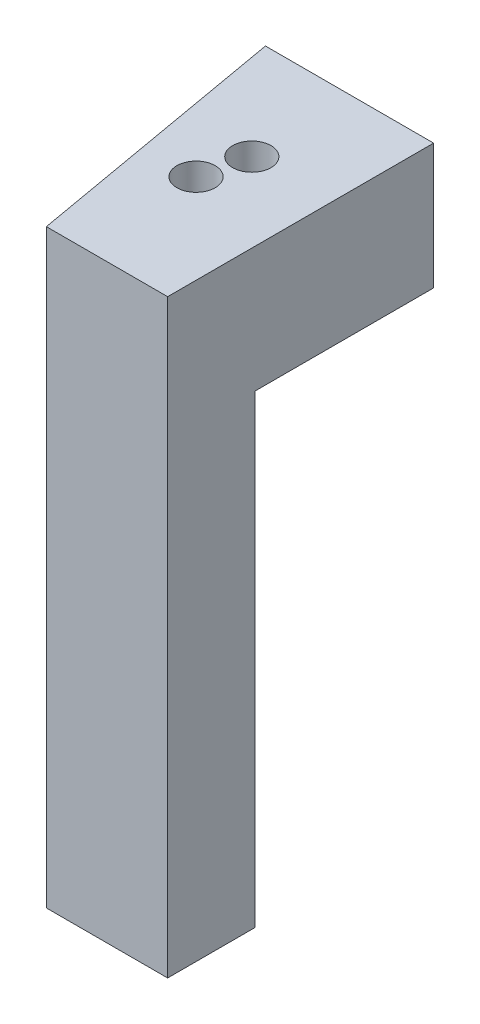
ISO-10303-21;
HEADER;
FILE_DESCRIPTION(('STEP AP214'),'2;1');
FILE_NAME('part.step','',(''),(''),'','','');
FILE_SCHEMA(('AUTOMOTIVE_DESIGN { 1 0 10303 214 1 1 1 1 }'));
ENDSEC;
DATA;
#1=APPLICATION_CONTEXT('core data for automotive mechanical design processes');
#2=APPLICATION_PROTOCOL_DEFINITION('international standard','automotive_design',2000,#1);
#3=PRODUCT_CONTEXT('',#1,'mechanical');
#4=PRODUCT('Part','Part','',(#3));
#5=PRODUCT_RELATED_PRODUCT_CATEGORY('part','',(#4));
#6=PRODUCT_DEFINITION_FORMATION('','',#4);
#7=PRODUCT_DEFINITION_CONTEXT('part definition',#1,'design');
#8=PRODUCT_DEFINITION('design','',#6,#7);
#9=PRODUCT_DEFINITION_SHAPE('','',#8);
#10=(LENGTH_UNIT() NAMED_UNIT(*) SI_UNIT(.MILLI.,.METRE.));
#11=(NAMED_UNIT(*) PLANE_ANGLE_UNIT() SI_UNIT($,.RADIAN.));
#12=(NAMED_UNIT(*) SI_UNIT($,.STERADIAN.) SOLID_ANGLE_UNIT());
#13=UNCERTAINTY_MEASURE_WITH_UNIT(LENGTH_MEASURE(1.E-05),#10,'distance_accuracy_value','');
#14=(GEOMETRIC_REPRESENTATION_CONTEXT(3) GLOBAL_UNCERTAINTY_ASSIGNED_CONTEXT((#13)) GLOBAL_UNIT_ASSIGNED_CONTEXT((#10,
#11,#12)) REPRESENTATION_CONTEXT('',''));
#15=CARTESIAN_POINT('',(0.,0.,0.));
#16=DIRECTION('',(0.,0.,1.));
#17=DIRECTION('',(1.,0.,0.));
#18=AXIS2_PLACEMENT_3D('',#15,#16,#17);
#19=CARTESIAN_POINT('',(10.,50.8,-25.4));
#20=DIRECTION('',(-1.,0.,0.));
#21=DIRECTION('',(0.,0.,1.));
#22=AXIS2_PLACEMENT_3D('',#19,#20,#21);
#23=PLANE('',#22);
#24=DIRECTION('',(0.,0.,-1.));
#25=VECTOR('',#24,1.);
#26=CARTESIAN_POINT('',(10.,50.8,-25.4));
#27=LINE('',#26,#25);
#28=CARTESIAN_POINT('',(10.,50.8,-2.5));
#29=VERTEX_POINT('',#28);
#30=CARTESIAN_POINT('',(10.,50.8,-25.4));
#31=VERTEX_POINT('',#30);
#32=EDGE_CURVE('E108',#29,#31,#27,.T.);
#33=ORIENTED_EDGE('',*,*,#32,.F.);
#34=DIRECTION('',(0.,-1.,0.));
#35=VECTOR('',#34,1.);
#36=CARTESIAN_POINT('',(10.,50.8,-2.5));
#37=LINE('',#36,#35);
#38=CARTESIAN_POINT('',(10.,0.,-2.5));
#39=VERTEX_POINT('',#38);
#40=EDGE_CURVE('E87',#29,#39,#37,.T.);
#41=ORIENTED_EDGE('',*,*,#40,.T.);
#42=DIRECTION('',(0.,0.,-1.));
#43=VECTOR('',#42,1.);
#44=CARTESIAN_POINT('',(10.,0.,-25.4));
#45=LINE('',#44,#43);
#46=CARTESIAN_POINT('',(10.,0.,-10.));
#47=VERTEX_POINT('',#46);
#48=EDGE_CURVE('E55',#39,#47,#45,.T.);
#49=ORIENTED_EDGE('',*,*,#48,.T.);
#50=DIRECTION('',(0.,-1.,0.));
#51=VECTOR('',#50,1.);
#52=CARTESIAN_POINT('',(10.,40.,-10.));
#53=LINE('',#52,#51);
#54=CARTESIAN_POINT('',(10.,40.,-10.));
#55=VERTEX_POINT('',#54);
#56=EDGE_CURVE('E116',#55,#47,#53,.T.);
#57=ORIENTED_EDGE('',*,*,#56,.F.);
#58=DIRECTION('',(0.,0.,1.));
#59=VECTOR('',#58,1.);
#60=CARTESIAN_POINT('',(10.,40.,-10.));
#61=LINE('',#60,#59);
#62=CARTESIAN_POINT('',(10.,40.,-25.4));
#63=VERTEX_POINT('',#62);
#64=EDGE_CURVE('E122',#63,#55,#61,.T.);
#65=ORIENTED_EDGE('',*,*,#64,.F.);
#66=DIRECTION('',(0.,-1.,0.));
#67=VECTOR('',#66,1.);
#68=CARTESIAN_POINT('',(10.,50.8,-25.4));
#69=LINE('',#68,#67);
#70=EDGE_CURVE('E11',#31,#63,#69,.T.);
#71=ORIENTED_EDGE('',*,*,#70,.F.);
#72=EDGE_LOOP('',(#33,#41,#49,#57,#65,#71));
#73=FACE_BOUND('',#72,.T.);
#74=ADVANCED_FACE('F33',(#73),#23,.F.);
#75=CARTESIAN_POINT('',(-4.4787053099951,50.8,-25.4));
#76=DIRECTION('',(0.,0.,1.));
#77=DIRECTION('',(1.,0.,0.));
#78=AXIS2_PLACEMENT_3D('',#75,#76,#77);
#79=PLANE('',#78);
#80=ORIENTED_EDGE('',*,*,#70,.T.);
#81=DIRECTION('',(1.,0.,0.));
#82=VECTOR('',#81,1.);
#83=CARTESIAN_POINT('',(10.,40.,-25.4));
#84=LINE('',#83,#82);
#85=CARTESIAN_POINT('',(-4.4787053099951,40.,-25.4));
#86=VERTEX_POINT('',#85);
#87=EDGE_CURVE('E118',#86,#63,#84,.T.);
#88=ORIENTED_EDGE('',*,*,#87,.F.);
#89=DIRECTION('',(0.,-1.,0.));
#90=VECTOR('',#89,1.);
#91=CARTESIAN_POINT('',(-4.4787053099951,50.8,-25.4));
#92=LINE('',#91,#90);
#93=CARTESIAN_POINT('',(-4.4787053099951,50.8,-25.4));
#94=VERTEX_POINT('',#93);
#95=EDGE_CURVE('E40',#94,#86,#92,.T.);
#96=ORIENTED_EDGE('',*,*,#95,.F.);
#97=DIRECTION('',(-1.,0.,0.));
#98=VECTOR('',#97,1.);
#99=CARTESIAN_POINT('',(-4.4787053099951,50.8,-25.4));
#100=LINE('',#99,#98);
#101=EDGE_CURVE('E105',#31,#94,#100,.T.);
#102=ORIENTED_EDGE('',*,*,#101,.F.);
#103=EDGE_LOOP('',(#80,#88,#96,#102));
#104=FACE_BOUND('',#103,.T.);
#105=ADVANCED_FACE('F164',(#104),#79,.F.);
#106=CARTESIAN_POINT('',(0.,50.8,0.));
#107=DIRECTION('',(0.984807753012208,0.,-0.173648177666934));
#108=DIRECTION('',(-0.173648177666934,0.,-0.984807753012208));
#109=AXIS2_PLACEMENT_3D('',#106,#107,#108);
#110=PLANE('',#109);
#111=DIRECTION('',(0.173648177666934,0.,0.984807753012207));
#112=VECTOR('',#111,1.);
#113=CARTESIAN_POINT('',(0.,0.,0.));
#114=LINE('',#113,#112);
#115=CARTESIAN_POINT('',(-1.76326980708469,0.,-10.));
#116=VERTEX_POINT('',#115);
#117=CARTESIAN_POINT('',(-0.440817451771171,0.,-2.5));
#118=VERTEX_POINT('',#117);
#119=EDGE_CURVE('E101',#116,#118,#114,.T.);
#120=ORIENTED_EDGE('',*,*,#119,.T.);
#121=DIRECTION('',(0.,-1.,0.));
#122=VECTOR('',#121,1.);
#123=CARTESIAN_POINT('',(-0.440817451771171,50.8,-2.5));
#124=LINE('',#123,#122);
#125=CARTESIAN_POINT('',(-0.440817451771171,50.8,-2.5));
#126=VERTEX_POINT('',#125);
#127=EDGE_CURVE('E47',#126,#118,#124,.T.);
#128=ORIENTED_EDGE('',*,*,#127,.F.);
#129=DIRECTION('',(0.173648177666934,0.,0.984807753012207));
#130=VECTOR('',#129,1.);
#131=CARTESIAN_POINT('',(0.,50.8,0.));
#132=LINE('',#131,#130);
#133=EDGE_CURVE('E98',#94,#126,#132,.T.);
#134=ORIENTED_EDGE('',*,*,#133,.F.);
#135=ORIENTED_EDGE('',*,*,#95,.T.);
#136=DIRECTION('',(-0.173648177666934,0.,-0.984807753012207));
#137=VECTOR('',#136,1.);
#138=CARTESIAN_POINT('',(-4.4787053099951,40.,-25.4));
#139=LINE('',#138,#137);
#140=CARTESIAN_POINT('',(-1.76326980708469,40.,-10.));
#141=VERTEX_POINT('',#140);
#142=EDGE_CURVE('E124',#141,#86,#139,.T.);
#143=ORIENTED_EDGE('',*,*,#142,.F.);
#144=DIRECTION('',(0.,-1.,0.));
#145=VECTOR('',#144,1.);
#146=CARTESIAN_POINT('',(-1.76326980708469,40.,-10.));
#147=LINE('',#146,#145);
#148=EDGE_CURVE('E113',#141,#116,#147,.T.);
#149=ORIENTED_EDGE('',*,*,#148,.T.);
#150=EDGE_LOOP('',(#120,#128,#134,#135,#143,#149));
#151=FACE_BOUND('',#150,.T.);
#152=ADVANCED_FACE('F96',(#151),#110,.F.);
#153=CARTESIAN_POINT('',(0.,50.8,0.));
#154=DIRECTION('',(0.,-1.,0.));
#155=DIRECTION('',(0.,0.,-1.));
#156=AXIS2_PLACEMENT_3D('',#153,#154,#155);
#157=PLANE('',#156);
#158=CARTESIAN_POINT('',(3.18210765,50.8,-16.56485457));
#159=DIRECTION('',(0.,-1.,0.));
#160=DIRECTION('',(0.,0.,-1.));
#161=AXIS2_PLACEMENT_3D('',#158,#159,#160);
#162=CIRCLE('',#161,1.65);
#163=CARTESIAN_POINT('',(3.18210765,50.8,-18.21485457));
#164=VERTEX_POINT('',#163);
#165=EDGE_CURVE('E132',#164,#164,#162,.T.);
#166=ORIENTED_EDGE('',*,*,#165,.T.);
#167=EDGE_LOOP('',(#166));
#168=FACE_BOUND('',#167,.T.);
#169=CARTESIAN_POINT('',(2.27814279270817,50.8,-12.66833721));
#170=DIRECTION('',(0.,-1.,0.));
#171=DIRECTION('',(0.,0.,-1.));
#172=AXIS2_PLACEMENT_3D('',#169,#170,#171);
#173=CIRCLE('',#172,1.65);
#174=CARTESIAN_POINT('',(2.27814279270817,50.8,-14.31833721));
#175=VERTEX_POINT('',#174);
#176=EDGE_CURVE('E136',#175,#175,#173,.T.);
#177=ORIENTED_EDGE('',*,*,#176,.T.);
#178=EDGE_LOOP('',(#177));
#179=FACE_BOUND('',#178,.T.);
#180=ORIENTED_EDGE('',*,*,#133,.T.);
#181=DIRECTION('',(1.,0.,0.));
#182=VECTOR('',#181,1.);
#183=CARTESIAN_POINT('',(10.,50.8,-2.5));
#184=LINE('',#183,#182);
#185=EDGE_CURVE('E85',#126,#29,#184,.T.);
#186=ORIENTED_EDGE('',*,*,#185,.T.);
#187=ORIENTED_EDGE('',*,*,#32,.T.);
#188=ORIENTED_EDGE('',*,*,#101,.T.);
#189=EDGE_LOOP('',(#180,#186,#187,#188));
#190=FACE_BOUND('',#189,.T.);
#191=ADVANCED_FACE('F103',(#168,#179,#190),#157,.F.);
#192=CARTESIAN_POINT('',(0.,0.,0.));
#193=DIRECTION('',(0.,-1.,0.));
#194=DIRECTION('',(0.,0.,-1.));
#195=AXIS2_PLACEMENT_3D('',#192,#193,#194);
#196=PLANE('',#195);
#197=DIRECTION('',(1.,0.,0.));
#198=VECTOR('',#197,1.);
#199=CARTESIAN_POINT('',(10.,0.,-2.5));
#200=LINE('',#199,#198);
#201=EDGE_CURVE('E91',#118,#39,#200,.T.);
#202=ORIENTED_EDGE('',*,*,#201,.F.);
#203=ORIENTED_EDGE('',*,*,#119,.F.);
#204=DIRECTION('',(-1.,0.,0.));
#205=VECTOR('',#204,1.);
#206=CARTESIAN_POINT('',(-1.76326980708469,0.,-10.));
#207=LINE('',#206,#205);
#208=EDGE_CURVE('E120',#47,#116,#207,.T.);
#209=ORIENTED_EDGE('',*,*,#208,.F.);
#210=ORIENTED_EDGE('',*,*,#48,.F.);
#211=EDGE_LOOP('',(#202,#203,#209,#210));
#212=FACE_BOUND('',#211,.T.);
#213=ADVANCED_FACE('F162',(#212),#196,.T.);
#214=CARTESIAN_POINT('',(-1.76326980708469,40.,-10.));
#215=DIRECTION('',(0.,0.,1.));
#216=DIRECTION('',(1.,0.,0.));
#217=AXIS2_PLACEMENT_3D('',#214,#215,#216);
#218=PLANE('',#217);
#219=ORIENTED_EDGE('',*,*,#208,.T.);
#220=ORIENTED_EDGE('',*,*,#148,.F.);
#221=DIRECTION('',(-1.,0.,0.));
#222=VECTOR('',#221,1.);
#223=CARTESIAN_POINT('',(-1.76326980708469,40.,-10.));
#224=LINE('',#223,#222);
#225=EDGE_CURVE('E126',#55,#141,#224,.T.);
#226=ORIENTED_EDGE('',*,*,#225,.F.);
#227=ORIENTED_EDGE('',*,*,#56,.T.);
#228=EDGE_LOOP('',(#219,#220,#226,#227));
#229=FACE_BOUND('',#228,.T.);
#230=ADVANCED_FACE('F152',(#229),#218,.F.);
#231=CARTESIAN_POINT('',(0.,40.,0.));
#232=DIRECTION('',(0.,1.,0.));
#233=DIRECTION('',(0.,0.,1.));
#234=AXIS2_PLACEMENT_3D('',#231,#232,#233);
#235=PLANE('',#234);
#236=CARTESIAN_POINT('',(3.18210765,40.,-16.56485457));
#237=DIRECTION('',(0.,-1.,0.));
#238=DIRECTION('',(0.,0.,-1.));
#239=AXIS2_PLACEMENT_3D('',#236,#237,#238);
#240=CIRCLE('',#239,1.65);
#241=CARTESIAN_POINT('',(3.18210765,40.,-18.21485457));
#242=VERTEX_POINT('',#241);
#243=EDGE_CURVE('E139',#242,#242,#240,.T.);
#244=ORIENTED_EDGE('',*,*,#243,.F.);
#245=EDGE_LOOP('',(#244));
#246=FACE_BOUND('',#245,.T.);
#247=CARTESIAN_POINT('',(2.27814279270817,40.,-12.66833721));
#248=DIRECTION('',(0.,-1.,0.));
#249=DIRECTION('',(0.,0.,-1.));
#250=AXIS2_PLACEMENT_3D('',#247,#248,#249);
#251=CIRCLE('',#250,1.65);
#252=CARTESIAN_POINT('',(2.27814279270817,40.,-14.31833721));
#253=VERTEX_POINT('',#252);
#254=EDGE_CURVE('E140',#253,#253,#251,.T.);
#255=ORIENTED_EDGE('',*,*,#254,.F.);
#256=EDGE_LOOP('',(#255));
#257=FACE_BOUND('',#256,.T.);
#258=ORIENTED_EDGE('',*,*,#64,.T.);
#259=ORIENTED_EDGE('',*,*,#225,.T.);
#260=ORIENTED_EDGE('',*,*,#142,.T.);
#261=ORIENTED_EDGE('',*,*,#87,.T.);
#262=EDGE_LOOP('',(#258,#259,#260,#261));
#263=FACE_BOUND('',#262,.T.);
#264=ADVANCED_FACE('F149',(#246,#257,#263),#235,.F.);
#265=CARTESIAN_POINT('',(10.,50.8,-2.5));
#266=DIRECTION('',(0.,0.,-1.));
#267=DIRECTION('',(-1.,0.,0.));
#268=AXIS2_PLACEMENT_3D('',#265,#266,#267);
#269=PLANE('',#268);
#270=ORIENTED_EDGE('',*,*,#201,.T.);
#271=ORIENTED_EDGE('',*,*,#40,.F.);
#272=ORIENTED_EDGE('',*,*,#185,.F.);
#273=ORIENTED_EDGE('',*,*,#127,.T.);
#274=EDGE_LOOP('',(#270,#271,#272,#273));
#275=FACE_BOUND('',#274,.T.);
#276=ADVANCED_FACE('F86',(#275),#269,.F.);
#277=CARTESIAN_POINT('',(2.27814279270817,65.4,-12.66833721));
#278=DIRECTION('',(0.,-1.,0.));
#279=DIRECTION('',(0.,0.,-1.));
#280=AXIS2_PLACEMENT_3D('',#277,#278,#279);
#281=CYLINDRICAL_SURFACE('',#280,1.65);
#282=ORIENTED_EDGE('',*,*,#254,.T.);
#283=EDGE_LOOP('',(#282));
#284=FACE_BOUND('',#283,.T.);
#285=ORIENTED_EDGE('',*,*,#176,.F.);
#286=EDGE_LOOP('',(#285));
#287=FACE_BOUND('',#286,.T.);
#288=ADVANCED_FACE('F182',(#284,#287),#281,.F.);
#289=CARTESIAN_POINT('',(3.18210765,65.4,-16.56485457));
#290=DIRECTION('',(0.,-1.,0.));
#291=DIRECTION('',(0.,0.,-1.));
#292=AXIS2_PLACEMENT_3D('',#289,#290,#291);
#293=CYLINDRICAL_SURFACE('',#292,1.65);
#294=ORIENTED_EDGE('',*,*,#243,.T.);
#295=EDGE_LOOP('',(#294));
#296=FACE_BOUND('',#295,.T.);
#297=ORIENTED_EDGE('',*,*,#165,.F.);
#298=EDGE_LOOP('',(#297));
#299=FACE_BOUND('',#298,.T.);
#300=ADVANCED_FACE('F146',(#296,#299),#293,.F.);
#301=CLOSED_SHELL('',(#74,#105,#152,#191,#213,#230,#264,#276,#288,#300));
#302=MANIFOLD_SOLID_BREP('B2',#301);
#303=ADVANCED_BREP_SHAPE_REPRESENTATION('',(#18,#302),#14);
#304=SHAPE_DEFINITION_REPRESENTATION(#9,#303);
ENDSEC;
END-ISO-10303-21;
